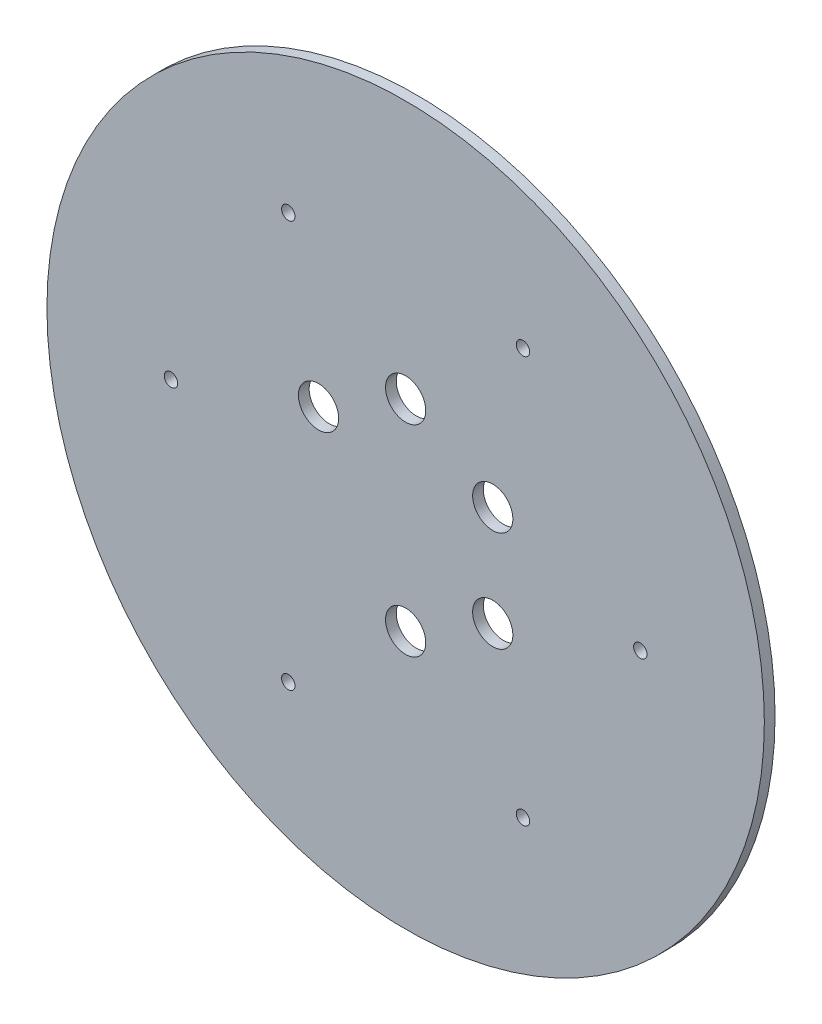
ISO-10303-21;
HEADER;
FILE_DESCRIPTION(('STEP AP214'),'2;1');
FILE_NAME('part.step','',(''),(''),'','','');
FILE_SCHEMA(('AUTOMOTIVE_DESIGN { 1 0 10303 214 1 1 1 1 }'));
ENDSEC;
DATA;
#1=APPLICATION_CONTEXT('core data for automotive mechanical design processes');
#2=APPLICATION_PROTOCOL_DEFINITION('international standard','automotive_design',2000,#1);
#3=PRODUCT_CONTEXT('',#1,'mechanical');
#4=PRODUCT('Part','Part','',(#3));
#5=PRODUCT_RELATED_PRODUCT_CATEGORY('part','',(#4));
#6=PRODUCT_DEFINITION_FORMATION('','',#4);
#7=PRODUCT_DEFINITION_CONTEXT('part definition',#1,'design');
#8=PRODUCT_DEFINITION('design','',#6,#7);
#9=PRODUCT_DEFINITION_SHAPE('','',#8);
#10=(LENGTH_UNIT() NAMED_UNIT(*) SI_UNIT(.MILLI.,.METRE.));
#11=(NAMED_UNIT(*) PLANE_ANGLE_UNIT() SI_UNIT($,.RADIAN.));
#12=(NAMED_UNIT(*) SI_UNIT($,.STERADIAN.) SOLID_ANGLE_UNIT());
#13=UNCERTAINTY_MEASURE_WITH_UNIT(LENGTH_MEASURE(1.E-05),#10,'distance_accuracy_value','');
#14=(GEOMETRIC_REPRESENTATION_CONTEXT(3) GLOBAL_UNCERTAINTY_ASSIGNED_CONTEXT((#13)) GLOBAL_UNIT_ASSIGNED_CONTEXT((#10,
#11,#12)) REPRESENTATION_CONTEXT('',''));
#15=CARTESIAN_POINT('',(0.,0.,0.));
#16=DIRECTION('',(0.,0.,1.));
#17=DIRECTION('',(1.,0.,0.));
#18=AXIS2_PLACEMENT_3D('',#15,#16,#17);
#19=CARTESIAN_POINT('',(0.,0.,1.6));
#20=DIRECTION('',(0.,0.,1.));
#21=DIRECTION('',(1.,0.,0.));
#22=AXIS2_PLACEMENT_3D('',#19,#20,#21);
#23=PLANE('',#22);
#24=CARTESIAN_POINT('',(0.,15.,1.6));
#25=DIRECTION('',(0.,0.,1.));
#26=DIRECTION('',(1.,0.,0.));
#27=AXIS2_PLACEMENT_3D('',#24,#25,#26);
#28=CIRCLE('',#27,3.);
#29=CARTESIAN_POINT('',(3.,15.,1.6));
#30=VERTEX_POINT('',#29);
#31=EDGE_CURVE('E99',#30,#30,#28,.T.);
#32=ORIENTED_EDGE('',*,*,#31,.F.);
#33=EDGE_LOOP('',(#32));
#34=FACE_BOUND('',#33,.T.);
#35=CARTESIAN_POINT('',(12.9903810567666,-7.5,1.6));
#36=DIRECTION('',(0.,0.,1.));
#37=DIRECTION('',(1.,0.,0.));
#38=AXIS2_PLACEMENT_3D('',#35,#36,#37);
#39=CIRCLE('',#38,3.);
#40=CARTESIAN_POINT('',(15.9903810567666,-7.5,1.6));
#41=VERTEX_POINT('',#40);
#42=EDGE_CURVE('E87',#41,#41,#39,.T.);
#43=ORIENTED_EDGE('',*,*,#42,.F.);
#44=EDGE_LOOP('',(#43));
#45=FACE_BOUND('',#44,.T.);
#46=CARTESIAN_POINT('',(17.5000000000002,30.3108891324552,1.6));
#47=DIRECTION('',(0.,0.,1.));
#48=DIRECTION('',(1.,0.,0.));
#49=AXIS2_PLACEMENT_3D('',#46,#47,#48);
#50=CIRCLE('',#49,1.);
#51=CARTESIAN_POINT('',(18.5000000000002,30.3108891324552,1.6));
#52=VERTEX_POINT('',#51);
#53=EDGE_CURVE('E75',#52,#52,#50,.T.);
#54=ORIENTED_EDGE('',*,*,#53,.F.);
#55=EDGE_LOOP('',(#54));
#56=FACE_BOUND('',#55,.T.);
#57=CARTESIAN_POINT('',(-35.,2.35922392732846E-13,1.6));
#58=DIRECTION('',(0.,0.,1.));
#59=DIRECTION('',(1.,0.,0.));
#60=AXIS2_PLACEMENT_3D('',#57,#58,#59);
#61=CIRCLE('',#60,0.999999999999998);
#62=CARTESIAN_POINT('',(-34.,2.35922392732846E-13,1.6));
#63=VERTEX_POINT('',#62);
#64=EDGE_CURVE('E63',#63,#63,#61,.T.);
#65=ORIENTED_EDGE('',*,*,#64,.F.);
#66=EDGE_LOOP('',(#65));
#67=FACE_BOUND('',#66,.T.);
#68=CARTESIAN_POINT('',(17.4999999999998,-30.3108891324555,1.6));
#69=DIRECTION('',(0.,0.,1.));
#70=DIRECTION('',(1.,0.,0.));
#71=AXIS2_PLACEMENT_3D('',#68,#69,#70);
#72=CIRCLE('',#71,1.);
#73=CARTESIAN_POINT('',(18.4999999999998,-30.3108891324555,1.6));
#74=VERTEX_POINT('',#73);
#75=EDGE_CURVE('E51',#74,#74,#72,.T.);
#76=ORIENTED_EDGE('',*,*,#75,.F.);
#77=EDGE_LOOP('',(#76));
#78=FACE_BOUND('',#77,.T.);
#79=CARTESIAN_POINT('',(0.,0.,1.6));
#80=DIRECTION('',(0.,0.,1.));
#81=DIRECTION('',(1.,0.,0.));
#82=AXIS2_PLACEMENT_3D('',#79,#80,#81);
#83=CIRCLE('',#82,53.5);
#84=CARTESIAN_POINT('',(53.5,0.,1.6));
#85=VERTEX_POINT('',#84);
#86=EDGE_CURVE('E10',#85,#85,#83,.T.);
#87=ORIENTED_EDGE('',*,*,#86,.T.);
#88=EDGE_LOOP('',(#87));
#89=FACE_BOUND('',#88,.T.);
#90=CARTESIAN_POINT('',(35.,-2.40934246767076E-13,1.6));
#91=DIRECTION('',(0.,0.,1.));
#92=DIRECTION('',(1.,0.,0.));
#93=AXIS2_PLACEMENT_3D('',#90,#91,#92);
#94=CIRCLE('',#93,0.999999999999998);
#95=CARTESIAN_POINT('',(36.,-2.40934246767076E-13,1.6));
#96=VERTEX_POINT('',#95);
#97=EDGE_CURVE('E46',#96,#96,#94,.T.);
#98=ORIENTED_EDGE('',*,*,#97,.F.);
#99=EDGE_LOOP('',(#98));
#100=FACE_BOUND('',#99,.T.);
#101=CARTESIAN_POINT('',(-17.5000000000002,-30.3108891324552,1.6));
#102=DIRECTION('',(0.,0.,1.));
#103=DIRECTION('',(1.,0.,0.));
#104=AXIS2_PLACEMENT_3D('',#101,#102,#103);
#105=CIRCLE('',#104,1.);
#106=CARTESIAN_POINT('',(-16.5000000000002,-30.3108891324552,1.6));
#107=VERTEX_POINT('',#106);
#108=EDGE_CURVE('E57',#107,#107,#105,.T.);
#109=ORIENTED_EDGE('',*,*,#108,.F.);
#110=EDGE_LOOP('',(#109));
#111=FACE_BOUND('',#110,.T.);
#112=CARTESIAN_POINT('',(-17.4999999999998,30.3108891324555,1.6));
#113=DIRECTION('',(0.,0.,1.));
#114=DIRECTION('',(1.,0.,0.));
#115=AXIS2_PLACEMENT_3D('',#112,#113,#114);
#116=CIRCLE('',#115,1.);
#117=CARTESIAN_POINT('',(-16.4999999999998,30.3108891324555,1.6));
#118=VERTEX_POINT('',#117);
#119=EDGE_CURVE('E69',#118,#118,#116,.T.);
#120=ORIENTED_EDGE('',*,*,#119,.F.);
#121=EDGE_LOOP('',(#120));
#122=FACE_BOUND('',#121,.T.);
#123=CARTESIAN_POINT('',(0.,-15.,1.6));
#124=DIRECTION('',(0.,0.,1.));
#125=DIRECTION('',(1.,0.,0.));
#126=AXIS2_PLACEMENT_3D('',#123,#124,#125);
#127=CIRCLE('',#126,3.);
#128=CARTESIAN_POINT('',(3.,-15.,1.6));
#129=VERTEX_POINT('',#128);
#130=EDGE_CURVE('E81',#129,#129,#127,.T.);
#131=ORIENTED_EDGE('',*,*,#130,.F.);
#132=EDGE_LOOP('',(#131));
#133=FACE_BOUND('',#132,.T.);
#134=CARTESIAN_POINT('',(12.9903810567666,7.5,1.6));
#135=DIRECTION('',(0.,0.,1.));
#136=DIRECTION('',(1.,0.,0.));
#137=AXIS2_PLACEMENT_3D('',#134,#135,#136);
#138=CIRCLE('',#137,3.);
#139=CARTESIAN_POINT('',(15.9903810567666,7.5,1.6));
#140=VERTEX_POINT('',#139);
#141=EDGE_CURVE('E93',#140,#140,#138,.T.);
#142=ORIENTED_EDGE('',*,*,#141,.F.);
#143=EDGE_LOOP('',(#142));
#144=FACE_BOUND('',#143,.T.);
#145=CARTESIAN_POINT('',(-12.9903810567666,7.50000000000001,1.6));
#146=DIRECTION('',(0.,0.,1.));
#147=DIRECTION('',(1.,0.,0.));
#148=AXIS2_PLACEMENT_3D('',#145,#146,#147);
#149=CIRCLE('',#148,3.);
#150=CARTESIAN_POINT('',(-9.99038105676657,7.50000000000001,1.6));
#151=VERTEX_POINT('',#150);
#152=EDGE_CURVE('E105',#151,#151,#149,.T.);
#153=ORIENTED_EDGE('',*,*,#152,.F.);
#154=EDGE_LOOP('',(#153));
#155=FACE_BOUND('',#154,.T.);
#156=ADVANCED_FACE('F35',(#34,#45,#56,#67,#78,#89,#100,#111,#122,#133,#144,#155),#23,.T.);
#157=CARTESIAN_POINT('',(0.,0.,0.));
#158=DIRECTION('',(0.,0.,1.));
#159=DIRECTION('',(1.,0.,0.));
#160=AXIS2_PLACEMENT_3D('',#157,#158,#159);
#161=PLANE('',#160);
#162=CARTESIAN_POINT('',(0.,0.,0.));
#163=DIRECTION('',(0.,0.,1.));
#164=DIRECTION('',(1.,0.,0.));
#165=AXIS2_PLACEMENT_3D('',#162,#163,#164);
#166=CIRCLE('',#165,53.5);
#167=CARTESIAN_POINT('',(53.5,0.,0.));
#168=VERTEX_POINT('',#167);
#169=EDGE_CURVE('E39',#168,#168,#166,.T.);
#170=ORIENTED_EDGE('',*,*,#169,.F.);
#171=EDGE_LOOP('',(#170));
#172=FACE_BOUND('',#171,.T.);
#173=CARTESIAN_POINT('',(35.,-2.40934246767076E-13,0.));
#174=DIRECTION('',(0.,0.,1.));
#175=DIRECTION('',(1.,0.,0.));
#176=AXIS2_PLACEMENT_3D('',#173,#174,#175);
#177=CIRCLE('',#176,0.999999999999998);
#178=CARTESIAN_POINT('',(36.,-2.40934246767076E-13,0.));
#179=VERTEX_POINT('',#178);
#180=EDGE_CURVE('E48',#179,#179,#177,.T.);
#181=ORIENTED_EDGE('',*,*,#180,.T.);
#182=EDGE_LOOP('',(#181));
#183=FACE_BOUND('',#182,.T.);
#184=CARTESIAN_POINT('',(17.4999999999998,-30.3108891324555,0.));
#185=DIRECTION('',(0.,0.,1.));
#186=DIRECTION('',(1.,0.,0.));
#187=AXIS2_PLACEMENT_3D('',#184,#185,#186);
#188=CIRCLE('',#187,1.);
#189=CARTESIAN_POINT('',(18.4999999999998,-30.3108891324555,0.));
#190=VERTEX_POINT('',#189);
#191=EDGE_CURVE('E54',#190,#190,#188,.T.);
#192=ORIENTED_EDGE('',*,*,#191,.T.);
#193=EDGE_LOOP('',(#192));
#194=FACE_BOUND('',#193,.T.);
#195=CARTESIAN_POINT('',(-17.5000000000002,-30.3108891324552,0.));
#196=DIRECTION('',(0.,0.,1.));
#197=DIRECTION('',(1.,0.,0.));
#198=AXIS2_PLACEMENT_3D('',#195,#196,#197);
#199=CIRCLE('',#198,1.);
#200=CARTESIAN_POINT('',(-16.5000000000002,-30.3108891324552,0.));
#201=VERTEX_POINT('',#200);
#202=EDGE_CURVE('E60',#201,#201,#199,.T.);
#203=ORIENTED_EDGE('',*,*,#202,.T.);
#204=EDGE_LOOP('',(#203));
#205=FACE_BOUND('',#204,.T.);
#206=CARTESIAN_POINT('',(-35.,2.35922392732846E-13,0.));
#207=DIRECTION('',(0.,0.,1.));
#208=DIRECTION('',(1.,0.,0.));
#209=AXIS2_PLACEMENT_3D('',#206,#207,#208);
#210=CIRCLE('',#209,0.999999999999998);
#211=CARTESIAN_POINT('',(-34.,2.35922392732846E-13,0.));
#212=VERTEX_POINT('',#211);
#213=EDGE_CURVE('E66',#212,#212,#210,.T.);
#214=ORIENTED_EDGE('',*,*,#213,.T.);
#215=EDGE_LOOP('',(#214));
#216=FACE_BOUND('',#215,.T.);
#217=CARTESIAN_POINT('',(-17.4999999999998,30.3108891324555,0.));
#218=DIRECTION('',(0.,0.,1.));
#219=DIRECTION('',(1.,0.,0.));
#220=AXIS2_PLACEMENT_3D('',#217,#218,#219);
#221=CIRCLE('',#220,1.);
#222=CARTESIAN_POINT('',(-16.4999999999998,30.3108891324555,0.));
#223=VERTEX_POINT('',#222);
#224=EDGE_CURVE('E72',#223,#223,#221,.T.);
#225=ORIENTED_EDGE('',*,*,#224,.T.);
#226=EDGE_LOOP('',(#225));
#227=FACE_BOUND('',#226,.T.);
#228=CARTESIAN_POINT('',(17.5000000000002,30.3108891324552,0.));
#229=DIRECTION('',(0.,0.,1.));
#230=DIRECTION('',(1.,0.,0.));
#231=AXIS2_PLACEMENT_3D('',#228,#229,#230);
#232=CIRCLE('',#231,1.);
#233=CARTESIAN_POINT('',(18.5000000000002,30.3108891324552,0.));
#234=VERTEX_POINT('',#233);
#235=EDGE_CURVE('E78',#234,#234,#232,.T.);
#236=ORIENTED_EDGE('',*,*,#235,.T.);
#237=EDGE_LOOP('',(#236));
#238=FACE_BOUND('',#237,.T.);
#239=CARTESIAN_POINT('',(0.,-15.,0.));
#240=DIRECTION('',(0.,0.,1.));
#241=DIRECTION('',(1.,0.,0.));
#242=AXIS2_PLACEMENT_3D('',#239,#240,#241);
#243=CIRCLE('',#242,3.);
#244=CARTESIAN_POINT('',(3.,-15.,0.));
#245=VERTEX_POINT('',#244);
#246=EDGE_CURVE('E84',#245,#245,#243,.T.);
#247=ORIENTED_EDGE('',*,*,#246,.T.);
#248=EDGE_LOOP('',(#247));
#249=FACE_BOUND('',#248,.T.);
#250=CARTESIAN_POINT('',(12.9903810567666,-7.5,0.));
#251=DIRECTION('',(0.,0.,1.));
#252=DIRECTION('',(1.,0.,0.));
#253=AXIS2_PLACEMENT_3D('',#250,#251,#252);
#254=CIRCLE('',#253,3.);
#255=CARTESIAN_POINT('',(15.9903810567666,-7.5,0.));
#256=VERTEX_POINT('',#255);
#257=EDGE_CURVE('E90',#256,#256,#254,.T.);
#258=ORIENTED_EDGE('',*,*,#257,.T.);
#259=EDGE_LOOP('',(#258));
#260=FACE_BOUND('',#259,.T.);
#261=CARTESIAN_POINT('',(12.9903810567666,7.5,0.));
#262=DIRECTION('',(0.,0.,1.));
#263=DIRECTION('',(1.,0.,0.));
#264=AXIS2_PLACEMENT_3D('',#261,#262,#263);
#265=CIRCLE('',#264,3.);
#266=CARTESIAN_POINT('',(15.9903810567666,7.5,0.));
#267=VERTEX_POINT('',#266);
#268=EDGE_CURVE('E96',#267,#267,#265,.T.);
#269=ORIENTED_EDGE('',*,*,#268,.T.);
#270=EDGE_LOOP('',(#269));
#271=FACE_BOUND('',#270,.T.);
#272=CARTESIAN_POINT('',(0.,15.,0.));
#273=DIRECTION('',(0.,0.,1.));
#274=DIRECTION('',(1.,0.,0.));
#275=AXIS2_PLACEMENT_3D('',#272,#273,#274);
#276=CIRCLE('',#275,3.);
#277=CARTESIAN_POINT('',(3.,15.,0.));
#278=VERTEX_POINT('',#277);
#279=EDGE_CURVE('E102',#278,#278,#276,.T.);
#280=ORIENTED_EDGE('',*,*,#279,.T.);
#281=EDGE_LOOP('',(#280));
#282=FACE_BOUND('',#281,.T.);
#283=CARTESIAN_POINT('',(-12.9903810567666,7.50000000000001,0.));
#284=DIRECTION('',(0.,0.,1.));
#285=DIRECTION('',(1.,0.,0.));
#286=AXIS2_PLACEMENT_3D('',#283,#284,#285);
#287=CIRCLE('',#286,3.);
#288=CARTESIAN_POINT('',(-9.99038105676657,7.50000000000001,0.));
#289=VERTEX_POINT('',#288);
#290=EDGE_CURVE('E108',#289,#289,#287,.T.);
#291=ORIENTED_EDGE('',*,*,#290,.T.);
#292=EDGE_LOOP('',(#291));
#293=FACE_BOUND('',#292,.T.);
#294=ADVANCED_FACE('F118',(#172,#183,#194,#205,#216,#227,#238,#249,#260,#271,#282,#293),#161,.F.);
#295=CARTESIAN_POINT('',(0.,0.,1.6));
#296=DIRECTION('',(0.,0.,-1.));
#297=DIRECTION('',(-1.,0.,0.));
#298=AXIS2_PLACEMENT_3D('',#295,#296,#297);
#299=CYLINDRICAL_SURFACE('',#298,53.5);
#300=ORIENTED_EDGE('',*,*,#86,.F.);
#301=EDGE_LOOP('',(#300));
#302=FACE_BOUND('',#301,.T.);
#303=ORIENTED_EDGE('',*,*,#169,.T.);
#304=EDGE_LOOP('',(#303));
#305=FACE_BOUND('',#304,.T.);
#306=ADVANCED_FACE('F37',(#302,#305),#299,.T.);
#307=CARTESIAN_POINT('',(35.,-2.40934246767076E-13,1.6));
#308=DIRECTION('',(0.,0.,-1.));
#309=DIRECTION('',(-1.,0.,0.));
#310=AXIS2_PLACEMENT_3D('',#307,#308,#309);
#311=CYLINDRICAL_SURFACE('',#310,0.999999999999998);
#312=ORIENTED_EDGE('',*,*,#97,.T.);
#313=EDGE_LOOP('',(#312));
#314=FACE_BOUND('',#313,.T.);
#315=ORIENTED_EDGE('',*,*,#180,.F.);
#316=EDGE_LOOP('',(#315));
#317=FACE_BOUND('',#316,.T.);
#318=ADVANCED_FACE('F128',(#314,#317),#311,.F.);
#319=CARTESIAN_POINT('',(17.4999999999998,-30.3108891324555,1.6));
#320=DIRECTION('',(0.,0.,-1.));
#321=DIRECTION('',(-1.,0.,0.));
#322=AXIS2_PLACEMENT_3D('',#319,#320,#321);
#323=CYLINDRICAL_SURFACE('',#322,1.);
#324=ORIENTED_EDGE('',*,*,#75,.T.);
#325=EDGE_LOOP('',(#324));
#326=FACE_BOUND('',#325,.T.);
#327=ORIENTED_EDGE('',*,*,#191,.F.);
#328=EDGE_LOOP('',(#327));
#329=FACE_BOUND('',#328,.T.);
#330=ADVANCED_FACE('F131',(#326,#329),#323,.F.);
#331=CARTESIAN_POINT('',(-17.5000000000002,-30.3108891324552,1.6));
#332=DIRECTION('',(0.,0.,-1.));
#333=DIRECTION('',(-1.,0.,0.));
#334=AXIS2_PLACEMENT_3D('',#331,#332,#333);
#335=CYLINDRICAL_SURFACE('',#334,1.);
#336=ORIENTED_EDGE('',*,*,#108,.T.);
#337=EDGE_LOOP('',(#336));
#338=FACE_BOUND('',#337,.T.);
#339=ORIENTED_EDGE('',*,*,#202,.F.);
#340=EDGE_LOOP('',(#339));
#341=FACE_BOUND('',#340,.T.);
#342=ADVANCED_FACE('F135',(#338,#341),#335,.F.);
#343=CARTESIAN_POINT('',(-35.,2.35922392732846E-13,1.6));
#344=DIRECTION('',(0.,0.,-1.));
#345=DIRECTION('',(-1.,0.,0.));
#346=AXIS2_PLACEMENT_3D('',#343,#344,#345);
#347=CYLINDRICAL_SURFACE('',#346,0.999999999999998);
#348=ORIENTED_EDGE('',*,*,#64,.T.);
#349=EDGE_LOOP('',(#348));
#350=FACE_BOUND('',#349,.T.);
#351=ORIENTED_EDGE('',*,*,#213,.F.);
#352=EDGE_LOOP('',(#351));
#353=FACE_BOUND('',#352,.T.);
#354=ADVANCED_FACE('F139',(#350,#353),#347,.F.);
#355=CARTESIAN_POINT('',(-17.4999999999998,30.3108891324555,1.6));
#356=DIRECTION('',(0.,0.,-1.));
#357=DIRECTION('',(-1.,0.,0.));
#358=AXIS2_PLACEMENT_3D('',#355,#356,#357);
#359=CYLINDRICAL_SURFACE('',#358,1.);
#360=ORIENTED_EDGE('',*,*,#119,.T.);
#361=EDGE_LOOP('',(#360));
#362=FACE_BOUND('',#361,.T.);
#363=ORIENTED_EDGE('',*,*,#224,.F.);
#364=EDGE_LOOP('',(#363));
#365=FACE_BOUND('',#364,.T.);
#366=ADVANCED_FACE('F143',(#362,#365),#359,.F.);
#367=CARTESIAN_POINT('',(17.5000000000002,30.3108891324552,1.6));
#368=DIRECTION('',(0.,0.,-1.));
#369=DIRECTION('',(-1.,0.,0.));
#370=AXIS2_PLACEMENT_3D('',#367,#368,#369);
#371=CYLINDRICAL_SURFACE('',#370,1.);
#372=ORIENTED_EDGE('',*,*,#53,.T.);
#373=EDGE_LOOP('',(#372));
#374=FACE_BOUND('',#373,.T.);
#375=ORIENTED_EDGE('',*,*,#235,.F.);
#376=EDGE_LOOP('',(#375));
#377=FACE_BOUND('',#376,.T.);
#378=ADVANCED_FACE('F147',(#374,#377),#371,.F.);
#379=CARTESIAN_POINT('',(0.,-15.,1.6));
#380=DIRECTION('',(0.,0.,-1.));
#381=DIRECTION('',(-1.,0.,0.));
#382=AXIS2_PLACEMENT_3D('',#379,#380,#381);
#383=CYLINDRICAL_SURFACE('',#382,3.);
#384=ORIENTED_EDGE('',*,*,#130,.T.);
#385=EDGE_LOOP('',(#384));
#386=FACE_BOUND('',#385,.T.);
#387=ORIENTED_EDGE('',*,*,#246,.F.);
#388=EDGE_LOOP('',(#387));
#389=FACE_BOUND('',#388,.T.);
#390=ADVANCED_FACE('F151',(#386,#389),#383,.F.);
#391=CARTESIAN_POINT('',(12.9903810567666,-7.5,1.6));
#392=DIRECTION('',(0.,0.,-1.));
#393=DIRECTION('',(-1.,0.,0.));
#394=AXIS2_PLACEMENT_3D('',#391,#392,#393);
#395=CYLINDRICAL_SURFACE('',#394,3.);
#396=ORIENTED_EDGE('',*,*,#42,.T.);
#397=EDGE_LOOP('',(#396));
#398=FACE_BOUND('',#397,.T.);
#399=ORIENTED_EDGE('',*,*,#257,.F.);
#400=EDGE_LOOP('',(#399));
#401=FACE_BOUND('',#400,.T.);
#402=ADVANCED_FACE('F155',(#398,#401),#395,.F.);
#403=CARTESIAN_POINT('',(12.9903810567666,7.5,1.6));
#404=DIRECTION('',(0.,0.,-1.));
#405=DIRECTION('',(-1.,0.,0.));
#406=AXIS2_PLACEMENT_3D('',#403,#404,#405);
#407=CYLINDRICAL_SURFACE('',#406,3.);
#408=ORIENTED_EDGE('',*,*,#141,.T.);
#409=EDGE_LOOP('',(#408));
#410=FACE_BOUND('',#409,.T.);
#411=ORIENTED_EDGE('',*,*,#268,.F.);
#412=EDGE_LOOP('',(#411));
#413=FACE_BOUND('',#412,.T.);
#414=ADVANCED_FACE('F159',(#410,#413),#407,.F.);
#415=CARTESIAN_POINT('',(0.,15.,1.6));
#416=DIRECTION('',(0.,0.,-1.));
#417=DIRECTION('',(-1.,0.,0.));
#418=AXIS2_PLACEMENT_3D('',#415,#416,#417);
#419=CYLINDRICAL_SURFACE('',#418,3.);
#420=ORIENTED_EDGE('',*,*,#31,.T.);
#421=EDGE_LOOP('',(#420));
#422=FACE_BOUND('',#421,.T.);
#423=ORIENTED_EDGE('',*,*,#279,.F.);
#424=EDGE_LOOP('',(#423));
#425=FACE_BOUND('',#424,.T.);
#426=ADVANCED_FACE('F163',(#422,#425),#419,.F.);
#427=CARTESIAN_POINT('',(-12.9903810567666,7.50000000000001,1.6));
#428=DIRECTION('',(0.,0.,-1.));
#429=DIRECTION('',(-1.,0.,0.));
#430=AXIS2_PLACEMENT_3D('',#427,#428,#429);
#431=CYLINDRICAL_SURFACE('',#430,3.);
#432=ORIENTED_EDGE('',*,*,#152,.T.);
#433=EDGE_LOOP('',(#432));
#434=FACE_BOUND('',#433,.T.);
#435=ORIENTED_EDGE('',*,*,#290,.F.);
#436=EDGE_LOOP('',(#435));
#437=FACE_BOUND('',#436,.T.);
#438=ADVANCED_FACE('F114',(#434,#437),#431,.F.);
#439=CLOSED_SHELL('',(#156,#294,#306,#318,#330,#342,#354,#366,#378,#390,#402,#414,#426,#438));
#440=MANIFOLD_SOLID_BREP('B2',#439);
#441=ADVANCED_BREP_SHAPE_REPRESENTATION('',(#18,#440),#14);
#442=SHAPE_DEFINITION_REPRESENTATION(#9,#441);
ENDSEC;
END-ISO-10303-21;
